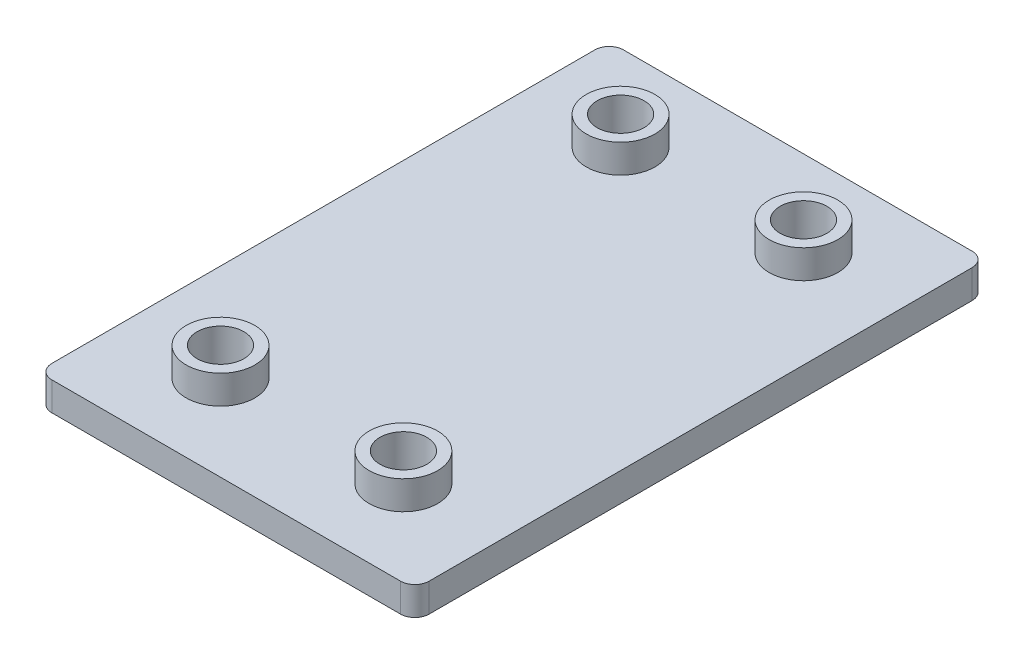
ISO-10303-21;
HEADER;
FILE_DESCRIPTION(('STEP AP214'),'2;1');
FILE_NAME('part.step','',(''),(''),'','','');
FILE_SCHEMA(('AUTOMOTIVE_DESIGN { 1 0 10303 214 1 1 1 1 }'));
ENDSEC;
DATA;
#1=APPLICATION_CONTEXT('core data for automotive mechanical design processes');
#2=APPLICATION_PROTOCOL_DEFINITION('international standard','automotive_design',2000,#1);
#3=PRODUCT_CONTEXT('',#1,'mechanical');
#4=PRODUCT('Part','Part','',(#3));
#5=PRODUCT_RELATED_PRODUCT_CATEGORY('part','',(#4));
#6=PRODUCT_DEFINITION_FORMATION('','',#4);
#7=PRODUCT_DEFINITION_CONTEXT('part definition',#1,'design');
#8=PRODUCT_DEFINITION('design','',#6,#7);
#9=PRODUCT_DEFINITION_SHAPE('','',#8);
#10=(LENGTH_UNIT() NAMED_UNIT(*) SI_UNIT(.MILLI.,.METRE.));
#11=(NAMED_UNIT(*) PLANE_ANGLE_UNIT() SI_UNIT($,.RADIAN.));
#12=(NAMED_UNIT(*) SI_UNIT($,.STERADIAN.) SOLID_ANGLE_UNIT());
#13=UNCERTAINTY_MEASURE_WITH_UNIT(LENGTH_MEASURE(1.E-05),#10,'distance_accuracy_value','');
#14=(GEOMETRIC_REPRESENTATION_CONTEXT(3) GLOBAL_UNCERTAINTY_ASSIGNED_CONTEXT((#13)) GLOBAL_UNIT_ASSIGNED_CONTEXT((#10,
#11,#12)) REPRESENTATION_CONTEXT('',''));
#15=CARTESIAN_POINT('',(0.,0.,0.));
#16=DIRECTION('',(0.,0.,1.));
#17=DIRECTION('',(1.,0.,0.));
#18=AXIS2_PLACEMENT_3D('',#15,#16,#17);
#19=CARTESIAN_POINT('',(-33.,5.,50.));
#20=DIRECTION('',(1.,0.,0.));
#21=DIRECTION('',(0.,0.,-1.));
#22=AXIS2_PLACEMENT_3D('',#19,#20,#21);
#23=PLANE('',#22);
#24=DIRECTION('',(0.,0.,1.));
#25=VECTOR('',#24,1.);
#26=CARTESIAN_POINT('',(-33.,0.,50.));
#27=LINE('',#26,#25);
#28=CARTESIAN_POINT('',(-33.,0.,-47.5));
#29=VERTEX_POINT('',#28);
#30=CARTESIAN_POINT('',(-33.,0.,47.5));
#31=VERTEX_POINT('',#30);
#32=EDGE_CURVE('E128',#29,#31,#27,.T.);
#33=ORIENTED_EDGE('',*,*,#32,.T.);
#34=DIRECTION('',(0.,-1.,0.));
#35=VECTOR('',#34,1.);
#36=CARTESIAN_POINT('',(-33.,5.,47.5));
#37=LINE('',#36,#35);
#38=CARTESIAN_POINT('',(-33.,5.,47.5));
#39=VERTEX_POINT('',#38);
#40=EDGE_CURVE('E151',#31,#39,#37,.F.);
#41=ORIENTED_EDGE('',*,*,#40,.T.);
#42=DIRECTION('',(0.,0.,1.));
#43=VECTOR('',#42,1.);
#44=CARTESIAN_POINT('',(-33.,5.,50.));
#45=LINE('',#44,#43);
#46=CARTESIAN_POINT('',(-33.,5.,-47.5));
#47=VERTEX_POINT('',#46);
#48=EDGE_CURVE('E126',#47,#39,#45,.T.);
#49=ORIENTED_EDGE('',*,*,#48,.F.);
#50=DIRECTION('',(0.,-1.,0.));
#51=VECTOR('',#50,1.);
#52=CARTESIAN_POINT('',(-33.,5.,-47.5));
#53=LINE('',#52,#51);
#54=EDGE_CURVE('E148',#47,#29,#53,.T.);
#55=ORIENTED_EDGE('',*,*,#54,.T.);
#56=EDGE_LOOP('',(#33,#41,#49,#55));
#57=FACE_BOUND('',#56,.T.);
#58=ADVANCED_FACE('F33',(#57),#23,.F.);
#59=CARTESIAN_POINT('',(33.,5.,50.));
#60=DIRECTION('',(0.,0.,-1.));
#61=DIRECTION('',(-1.,0.,0.));
#62=AXIS2_PLACEMENT_3D('',#59,#60,#61);
#63=PLANE('',#62);
#64=DIRECTION('',(1.,0.,0.));
#65=VECTOR('',#64,1.);
#66=CARTESIAN_POINT('',(33.,0.,50.));
#67=LINE('',#66,#65);
#68=CARTESIAN_POINT('',(-30.5,0.,50.));
#69=VERTEX_POINT('',#68);
#70=CARTESIAN_POINT('',(30.5,0.,50.));
#71=VERTEX_POINT('',#70);
#72=EDGE_CURVE('E124',#69,#71,#67,.T.);
#73=ORIENTED_EDGE('',*,*,#72,.T.);
#74=DIRECTION('',(0.,-1.,0.));
#75=VECTOR('',#74,1.);
#76=CARTESIAN_POINT('',(30.5,5.,50.));
#77=LINE('',#76,#75);
#78=CARTESIAN_POINT('',(30.5,5.,50.));
#79=VERTEX_POINT('',#78);
#80=EDGE_CURVE('E103',#71,#79,#77,.F.);
#81=ORIENTED_EDGE('',*,*,#80,.T.);
#82=DIRECTION('',(1.,0.,0.));
#83=VECTOR('',#82,1.);
#84=CARTESIAN_POINT('',(33.,5.,50.));
#85=LINE('',#84,#83);
#86=CARTESIAN_POINT('',(-30.5,5.,50.));
#87=VERTEX_POINT('',#86);
#88=EDGE_CURVE('E167',#87,#79,#85,.T.);
#89=ORIENTED_EDGE('',*,*,#88,.F.);
#90=DIRECTION('',(0.,-1.,0.));
#91=VECTOR('',#90,1.);
#92=CARTESIAN_POINT('',(-30.5,5.,50.));
#93=LINE('',#92,#91);
#94=EDGE_CURVE('E108',#87,#69,#93,.T.);
#95=ORIENTED_EDGE('',*,*,#94,.T.);
#96=EDGE_LOOP('',(#73,#81,#89,#95));
#97=FACE_BOUND('',#96,.T.);
#98=ADVANCED_FACE('F266',(#97),#63,.F.);
#99=CARTESIAN_POINT('',(33.,5.,50.));
#100=DIRECTION('',(-1.,0.,0.));
#101=DIRECTION('',(0.,0.,1.));
#102=AXIS2_PLACEMENT_3D('',#99,#100,#101);
#103=PLANE('',#102);
#104=DIRECTION('',(0.,0.,-1.));
#105=VECTOR('',#104,1.);
#106=CARTESIAN_POINT('',(33.,5.,50.));
#107=LINE('',#106,#105);
#108=CARTESIAN_POINT('',(33.,5.,47.5));
#109=VERTEX_POINT('',#108);
#110=CARTESIAN_POINT('',(33.,5.,-47.5));
#111=VERTEX_POINT('',#110);
#112=EDGE_CURVE('E117',#109,#111,#107,.T.);
#113=ORIENTED_EDGE('',*,*,#112,.F.);
#114=DIRECTION('',(0.,-1.,0.));
#115=VECTOR('',#114,1.);
#116=CARTESIAN_POINT('',(33.,5.,47.5));
#117=LINE('',#116,#115);
#118=CARTESIAN_POINT('',(33.,0.,47.5));
#119=VERTEX_POINT('',#118);
#120=EDGE_CURVE('E102',#109,#119,#117,.T.);
#121=ORIENTED_EDGE('',*,*,#120,.T.);
#122=DIRECTION('',(0.,0.,-1.));
#123=VECTOR('',#122,1.);
#124=CARTESIAN_POINT('',(33.,0.,50.));
#125=LINE('',#124,#123);
#126=CARTESIAN_POINT('',(33.,0.,-47.5));
#127=VERTEX_POINT('',#126);
#128=EDGE_CURVE('E115',#119,#127,#125,.T.);
#129=ORIENTED_EDGE('',*,*,#128,.T.);
#130=DIRECTION('',(0.,-1.,0.));
#131=VECTOR('',#130,1.);
#132=CARTESIAN_POINT('',(33.,5.,-47.5));
#133=LINE('',#132,#131);
#134=EDGE_CURVE('E119',#127,#111,#133,.F.);
#135=ORIENTED_EDGE('',*,*,#134,.T.);
#136=EDGE_LOOP('',(#113,#121,#129,#135));
#137=FACE_BOUND('',#136,.T.);
#138=ADVANCED_FACE('F114',(#137),#103,.F.);
#139=CARTESIAN_POINT('',(33.,5.,-50.));
#140=DIRECTION('',(0.,0.,1.));
#141=DIRECTION('',(1.,0.,0.));
#142=AXIS2_PLACEMENT_3D('',#139,#140,#141);
#143=PLANE('',#142);
#144=DIRECTION('',(-1.,0.,0.));
#145=VECTOR('',#144,1.);
#146=CARTESIAN_POINT('',(33.,0.,-50.));
#147=LINE('',#146,#145);
#148=CARTESIAN_POINT('',(30.5,0.,-50.));
#149=VERTEX_POINT('',#148);
#150=CARTESIAN_POINT('',(-30.5,0.,-50.));
#151=VERTEX_POINT('',#150);
#152=EDGE_CURVE('E123',#149,#151,#147,.T.);
#153=ORIENTED_EDGE('',*,*,#152,.T.);
#154=DIRECTION('',(0.,-1.,0.));
#155=VECTOR('',#154,1.);
#156=CARTESIAN_POINT('',(-30.5,5.,-50.));
#157=LINE('',#156,#155);
#158=CARTESIAN_POINT('',(-30.5,5.,-50.));
#159=VERTEX_POINT('',#158);
#160=EDGE_CURVE('E11',#151,#159,#157,.F.);
#161=ORIENTED_EDGE('',*,*,#160,.T.);
#162=DIRECTION('',(-1.,0.,0.));
#163=VECTOR('',#162,1.);
#164=CARTESIAN_POINT('',(33.,5.,-50.));
#165=LINE('',#164,#163);
#166=CARTESIAN_POINT('',(30.5,5.,-50.));
#167=VERTEX_POINT('',#166);
#168=EDGE_CURVE('E132',#167,#159,#165,.T.);
#169=ORIENTED_EDGE('',*,*,#168,.F.);
#170=DIRECTION('',(0.,-1.,0.));
#171=VECTOR('',#170,1.);
#172=CARTESIAN_POINT('',(30.5,5.,-50.));
#173=LINE('',#172,#171);
#174=EDGE_CURVE('E41',#167,#149,#173,.T.);
#175=ORIENTED_EDGE('',*,*,#174,.T.);
#176=EDGE_LOOP('',(#153,#161,#169,#175));
#177=FACE_BOUND('',#176,.T.);
#178=ADVANCED_FACE('F154',(#177),#143,.F.);
#179=CARTESIAN_POINT('',(0.,5.,0.));
#180=DIRECTION('',(0.,1.,0.));
#181=DIRECTION('',(0.,0.,1.));
#182=AXIS2_PLACEMENT_3D('',#179,#180,#181);
#183=PLANE('',#182);
#184=CARTESIAN_POINT('',(-16.,5.,35.));
#185=DIRECTION('',(0.,1.,0.));
#186=DIRECTION('',(0.,0.,-1.));
#187=AXIS2_PLACEMENT_3D('',#184,#185,#186);
#188=CIRCLE('',#187,6.);
#189=CARTESIAN_POINT('',(-16.,5.,29.));
#190=VERTEX_POINT('',#189);
#191=EDGE_CURVE('E195',#190,#190,#188,.T.);
#192=ORIENTED_EDGE('',*,*,#191,.F.);
#193=EDGE_LOOP('',(#192));
#194=FACE_BOUND('',#193,.T.);
#195=CARTESIAN_POINT('',(16.,5.,35.));
#196=DIRECTION('',(0.,1.,0.));
#197=DIRECTION('',(0.,0.,1.));
#198=AXIS2_PLACEMENT_3D('',#195,#196,#197);
#199=CIRCLE('',#198,6.);
#200=CARTESIAN_POINT('',(16.,5.,41.));
#201=VERTEX_POINT('',#200);
#202=EDGE_CURVE('E189',#201,#201,#199,.T.);
#203=ORIENTED_EDGE('',*,*,#202,.F.);
#204=EDGE_LOOP('',(#203));
#205=FACE_BOUND('',#204,.T.);
#206=CARTESIAN_POINT('',(16.,5.,-35.));
#207=DIRECTION('',(0.,1.,0.));
#208=DIRECTION('',(0.,0.,-1.));
#209=AXIS2_PLACEMENT_3D('',#206,#207,#208);
#210=CIRCLE('',#209,6.);
#211=CARTESIAN_POINT('',(16.,5.,-41.));
#212=VERTEX_POINT('',#211);
#213=EDGE_CURVE('E183',#212,#212,#210,.T.);
#214=ORIENTED_EDGE('',*,*,#213,.F.);
#215=EDGE_LOOP('',(#214));
#216=FACE_BOUND('',#215,.T.);
#217=CARTESIAN_POINT('',(-16.,5.,-35.));
#218=DIRECTION('',(0.,1.,0.));
#219=DIRECTION('',(0.,0.,1.));
#220=AXIS2_PLACEMENT_3D('',#217,#218,#219);
#221=CIRCLE('',#220,6.);
#222=CARTESIAN_POINT('',(-16.,5.,-29.));
#223=VERTEX_POINT('',#222);
#224=EDGE_CURVE('E172',#223,#223,#221,.T.);
#225=ORIENTED_EDGE('',*,*,#224,.F.);
#226=EDGE_LOOP('',(#225));
#227=FACE_BOUND('',#226,.T.);
#228=ORIENTED_EDGE('',*,*,#88,.T.);
#229=CARTESIAN_POINT('',(30.5,5.,47.5));
#230=DIRECTION('',(0.,1.,0.));
#231=DIRECTION('',(0.,0.,1.));
#232=AXIS2_PLACEMENT_3D('',#229,#230,#231);
#233=CIRCLE('',#232,2.5);
#234=EDGE_CURVE('E146',#79,#109,#233,.T.);
#235=ORIENTED_EDGE('',*,*,#234,.T.);
#236=ORIENTED_EDGE('',*,*,#112,.T.);
#237=CARTESIAN_POINT('',(30.5,5.,-47.5));
#238=DIRECTION('',(0.,1.,0.));
#239=DIRECTION('',(0.,0.,1.));
#240=AXIS2_PLACEMENT_3D('',#237,#238,#239);
#241=CIRCLE('',#240,2.5);
#242=EDGE_CURVE('E53',#111,#167,#241,.T.);
#243=ORIENTED_EDGE('',*,*,#242,.T.);
#244=ORIENTED_EDGE('',*,*,#168,.T.);
#245=CARTESIAN_POINT('',(-30.5,5.,-47.5));
#246=DIRECTION('',(0.,1.,0.));
#247=DIRECTION('',(0.,0.,1.));
#248=AXIS2_PLACEMENT_3D('',#245,#246,#247);
#249=CIRCLE('',#248,2.5);
#250=EDGE_CURVE('E142',#159,#47,#249,.T.);
#251=ORIENTED_EDGE('',*,*,#250,.T.);
#252=ORIENTED_EDGE('',*,*,#48,.T.);
#253=CARTESIAN_POINT('',(-30.5,5.,47.5));
#254=DIRECTION('',(0.,1.,0.));
#255=DIRECTION('',(0.,0.,1.));
#256=AXIS2_PLACEMENT_3D('',#253,#254,#255);
#257=CIRCLE('',#256,2.5);
#258=EDGE_CURVE('E144',#39,#87,#257,.T.);
#259=ORIENTED_EDGE('',*,*,#258,.T.);
#260=EDGE_LOOP('',(#228,#235,#236,#243,#244,#251,#252,#259));
#261=FACE_BOUND('',#260,.T.);
#262=ADVANCED_FACE('F286',(#194,#205,#216,#227,#261),#183,.T.);
#263=CARTESIAN_POINT('',(0.,0.,0.));
#264=DIRECTION('',(0.,1.,0.));
#265=DIRECTION('',(0.,0.,1.));
#266=AXIS2_PLACEMENT_3D('',#263,#264,#265);
#267=PLANE('',#266);
#268=CARTESIAN_POINT('',(-16.,0.,-35.));
#269=DIRECTION('',(0.,1.,0.));
#270=DIRECTION('',(0.,0.,1.));
#271=AXIS2_PLACEMENT_3D('',#268,#269,#270);
#272=CIRCLE('',#271,2.5);
#273=CARTESIAN_POINT('',(-16.,0.,-32.5));
#274=VERTEX_POINT('',#273);
#275=EDGE_CURVE('E236',#274,#274,#272,.T.);
#276=ORIENTED_EDGE('',*,*,#275,.T.);
#277=EDGE_LOOP('',(#276));
#278=FACE_BOUND('',#277,.T.);
#279=CARTESIAN_POINT('',(16.,0.,-35.));
#280=DIRECTION('',(0.,1.,0.));
#281=DIRECTION('',(0.,0.,1.));
#282=AXIS2_PLACEMENT_3D('',#279,#280,#281);
#283=CIRCLE('',#282,2.5);
#284=CARTESIAN_POINT('',(16.,0.,-32.5));
#285=VERTEX_POINT('',#284);
#286=EDGE_CURVE('E224',#285,#285,#283,.T.);
#287=ORIENTED_EDGE('',*,*,#286,.T.);
#288=EDGE_LOOP('',(#287));
#289=FACE_BOUND('',#288,.T.);
#290=CARTESIAN_POINT('',(16.,0.,35.));
#291=DIRECTION('',(0.,1.,0.));
#292=DIRECTION('',(0.,0.,1.));
#293=AXIS2_PLACEMENT_3D('',#290,#291,#292);
#294=CIRCLE('',#293,2.5);
#295=CARTESIAN_POINT('',(16.,0.,37.5));
#296=VERTEX_POINT('',#295);
#297=EDGE_CURVE('E212',#296,#296,#294,.T.);
#298=ORIENTED_EDGE('',*,*,#297,.T.);
#299=EDGE_LOOP('',(#298));
#300=FACE_BOUND('',#299,.T.);
#301=CARTESIAN_POINT('',(-16.,0.,35.));
#302=DIRECTION('',(0.,1.,0.));
#303=DIRECTION('',(0.,0.,1.));
#304=AXIS2_PLACEMENT_3D('',#301,#302,#303);
#305=CIRCLE('',#304,2.5);
#306=CARTESIAN_POINT('',(-16.,0.,37.5));
#307=VERTEX_POINT('',#306);
#308=EDGE_CURVE('E198',#307,#307,#305,.T.);
#309=ORIENTED_EDGE('',*,*,#308,.T.);
#310=EDGE_LOOP('',(#309));
#311=FACE_BOUND('',#310,.T.);
#312=ORIENTED_EDGE('',*,*,#128,.F.);
#313=CARTESIAN_POINT('',(30.5,0.,47.5));
#314=DIRECTION('',(0.,1.,0.));
#315=DIRECTION('',(0.,0.,1.));
#316=AXIS2_PLACEMENT_3D('',#313,#314,#315);
#317=CIRCLE('',#316,2.5);
#318=EDGE_CURVE('E98',#119,#71,#317,.F.);
#319=ORIENTED_EDGE('',*,*,#318,.T.);
#320=ORIENTED_EDGE('',*,*,#72,.F.);
#321=CARTESIAN_POINT('',(-30.5,0.,47.5));
#322=DIRECTION('',(0.,1.,0.));
#323=DIRECTION('',(0.,0.,1.));
#324=AXIS2_PLACEMENT_3D('',#321,#322,#323);
#325=CIRCLE('',#324,2.5);
#326=EDGE_CURVE('E109',#69,#31,#325,.F.);
#327=ORIENTED_EDGE('',*,*,#326,.T.);
#328=ORIENTED_EDGE('',*,*,#32,.F.);
#329=CARTESIAN_POINT('',(-30.5,0.,-47.5));
#330=DIRECTION('',(0.,1.,0.));
#331=DIRECTION('',(0.,0.,1.));
#332=AXIS2_PLACEMENT_3D('',#329,#330,#331);
#333=CIRCLE('',#332,2.5);
#334=EDGE_CURVE('E135',#29,#151,#333,.F.);
#335=ORIENTED_EDGE('',*,*,#334,.T.);
#336=ORIENTED_EDGE('',*,*,#152,.F.);
#337=CARTESIAN_POINT('',(30.5,0.,-47.5));
#338=DIRECTION('',(0.,1.,0.));
#339=DIRECTION('',(0.,0.,1.));
#340=AXIS2_PLACEMENT_3D('',#337,#338,#339);
#341=CIRCLE('',#340,2.5);
#342=EDGE_CURVE('E118',#149,#127,#341,.F.);
#343=ORIENTED_EDGE('',*,*,#342,.T.);
#344=EDGE_LOOP('',(#312,#319,#320,#327,#328,#335,#336,#343));
#345=FACE_BOUND('',#344,.T.);
#346=ADVANCED_FACE('F121',(#278,#289,#300,#311,#345),#267,.F.);
#347=CARTESIAN_POINT('',(-16.,10.,-35.));
#348=DIRECTION('',(0.,-1.,0.));
#349=DIRECTION('',(0.,0.,-1.));
#350=AXIS2_PLACEMENT_3D('',#347,#348,#349);
#351=CYLINDRICAL_SURFACE('',#350,6.);
#352=CARTESIAN_POINT('',(-16.,10.,-35.));
#353=DIRECTION('',(0.,1.,0.));
#354=DIRECTION('',(0.,0.,1.));
#355=AXIS2_PLACEMENT_3D('',#352,#353,#354);
#356=CIRCLE('',#355,6.);
#357=CARTESIAN_POINT('',(-16.,10.,-29.));
#358=VERTEX_POINT('',#357);
#359=EDGE_CURVE('E176',#358,#358,#356,.T.);
#360=ORIENTED_EDGE('',*,*,#359,.F.);
#361=EDGE_LOOP('',(#360));
#362=FACE_BOUND('',#361,.T.);
#363=ORIENTED_EDGE('',*,*,#224,.T.);
#364=EDGE_LOOP('',(#363));
#365=FACE_BOUND('',#364,.T.);
#366=ADVANCED_FACE('F254',(#362,#365),#351,.T.);
#367=CARTESIAN_POINT('',(-16.,10.,-35.));
#368=DIRECTION('',(0.,1.,0.));
#369=DIRECTION('',(0.,0.,1.));
#370=AXIS2_PLACEMENT_3D('',#367,#368,#369);
#371=PLANE('',#370);
#372=CARTESIAN_POINT('',(-16.,10.,-35.));
#373=DIRECTION('',(0.,1.,0.));
#374=DIRECTION('',(0.,0.,1.));
#375=AXIS2_PLACEMENT_3D('',#372,#373,#374);
#376=CIRCLE('',#375,4.1);
#377=CARTESIAN_POINT('',(-16.,10.,-30.9));
#378=VERTEX_POINT('',#377);
#379=EDGE_CURVE('E245',#378,#378,#376,.T.);
#380=ORIENTED_EDGE('',*,*,#379,.F.);
#381=EDGE_LOOP('',(#380));
#382=FACE_BOUND('',#381,.T.);
#383=ORIENTED_EDGE('',*,*,#359,.T.);
#384=EDGE_LOOP('',(#383));
#385=FACE_BOUND('',#384,.T.);
#386=ADVANCED_FACE('F251',(#382,#385),#371,.T.);
#387=CARTESIAN_POINT('',(16.,10.,-35.));
#388=DIRECTION('',(0.,-1.,0.));
#389=DIRECTION('',(0.,0.,-1.));
#390=AXIS2_PLACEMENT_3D('',#387,#388,#389);
#391=CYLINDRICAL_SURFACE('',#390,6.);
#392=CARTESIAN_POINT('',(16.,10.,-35.));
#393=DIRECTION('',(0.,1.,0.));
#394=DIRECTION('',(0.,0.,-1.));
#395=AXIS2_PLACEMENT_3D('',#392,#393,#394);
#396=CIRCLE('',#395,6.);
#397=CARTESIAN_POINT('',(16.,10.,-41.));
#398=VERTEX_POINT('',#397);
#399=EDGE_CURVE('E181',#398,#398,#396,.T.);
#400=ORIENTED_EDGE('',*,*,#399,.F.);
#401=EDGE_LOOP('',(#400));
#402=FACE_BOUND('',#401,.T.);
#403=ORIENTED_EDGE('',*,*,#213,.T.);
#404=EDGE_LOOP('',(#403));
#405=FACE_BOUND('',#404,.T.);
#406=ADVANCED_FACE('F253',(#402,#405),#391,.T.);
#407=CARTESIAN_POINT('',(16.,10.,-35.));
#408=DIRECTION('',(0.,-1.,0.));
#409=DIRECTION('',(0.,0.,-1.));
#410=AXIS2_PLACEMENT_3D('',#407,#408,#409);
#411=PLANE('',#410);
#412=CARTESIAN_POINT('',(16.,10.,-35.));
#413=DIRECTION('',(0.,1.,0.));
#414=DIRECTION('',(0.,0.,1.));
#415=AXIS2_PLACEMENT_3D('',#412,#413,#414);
#416=CIRCLE('',#415,4.1);
#417=CARTESIAN_POINT('',(16.,10.,-30.9));
#418=VERTEX_POINT('',#417);
#419=EDGE_CURVE('E233',#418,#418,#416,.T.);
#420=ORIENTED_EDGE('',*,*,#419,.F.);
#421=EDGE_LOOP('',(#420));
#422=FACE_BOUND('',#421,.T.);
#423=ORIENTED_EDGE('',*,*,#399,.T.);
#424=EDGE_LOOP('',(#423));
#425=FACE_BOUND('',#424,.T.);
#426=ADVANCED_FACE('F260',(#422,#425),#411,.F.);
#427=CARTESIAN_POINT('',(16.,10.,35.));
#428=DIRECTION('',(0.,-1.,0.));
#429=DIRECTION('',(0.,0.,-1.));
#430=AXIS2_PLACEMENT_3D('',#427,#428,#429);
#431=CYLINDRICAL_SURFACE('',#430,6.);
#432=CARTESIAN_POINT('',(16.,10.,35.));
#433=DIRECTION('',(0.,1.,0.));
#434=DIRECTION('',(0.,0.,1.));
#435=AXIS2_PLACEMENT_3D('',#432,#433,#434);
#436=CIRCLE('',#435,6.);
#437=CARTESIAN_POINT('',(16.,10.,41.));
#438=VERTEX_POINT('',#437);
#439=EDGE_CURVE('E186',#438,#438,#436,.T.);
#440=ORIENTED_EDGE('',*,*,#439,.F.);
#441=EDGE_LOOP('',(#440));
#442=FACE_BOUND('',#441,.T.);
#443=ORIENTED_EDGE('',*,*,#202,.T.);
#444=EDGE_LOOP('',(#443));
#445=FACE_BOUND('',#444,.T.);
#446=ADVANCED_FACE('F462',(#442,#445),#431,.T.);
#447=CARTESIAN_POINT('',(16.,10.,35.));
#448=DIRECTION('',(0.,1.,0.));
#449=DIRECTION('',(0.,0.,1.));
#450=AXIS2_PLACEMENT_3D('',#447,#448,#449);
#451=PLANE('',#450);
#452=CARTESIAN_POINT('',(16.,10.,35.));
#453=DIRECTION('',(0.,1.,0.));
#454=DIRECTION('',(0.,0.,1.));
#455=AXIS2_PLACEMENT_3D('',#452,#453,#454);
#456=CIRCLE('',#455,4.1);
#457=CARTESIAN_POINT('',(16.,10.,39.1));
#458=VERTEX_POINT('',#457);
#459=EDGE_CURVE('E221',#458,#458,#456,.T.);
#460=ORIENTED_EDGE('',*,*,#459,.F.);
#461=EDGE_LOOP('',(#460));
#462=FACE_BOUND('',#461,.T.);
#463=ORIENTED_EDGE('',*,*,#439,.T.);
#464=EDGE_LOOP('',(#463));
#465=FACE_BOUND('',#464,.T.);
#466=ADVANCED_FACE('F454',(#462,#465),#451,.T.);
#467=CARTESIAN_POINT('',(-16.,10.,35.));
#468=DIRECTION('',(0.,-1.,0.));
#469=DIRECTION('',(0.,0.,-1.));
#470=AXIS2_PLACEMENT_3D('',#467,#468,#469);
#471=CYLINDRICAL_SURFACE('',#470,6.);
#472=CARTESIAN_POINT('',(-16.,10.,35.));
#473=DIRECTION('',(0.,1.,0.));
#474=DIRECTION('',(0.,0.,-1.));
#475=AXIS2_PLACEMENT_3D('',#472,#473,#474);
#476=CIRCLE('',#475,6.);
#477=CARTESIAN_POINT('',(-16.,10.,29.));
#478=VERTEX_POINT('',#477);
#479=EDGE_CURVE('E192',#478,#478,#476,.T.);
#480=ORIENTED_EDGE('',*,*,#479,.F.);
#481=EDGE_LOOP('',(#480));
#482=FACE_BOUND('',#481,.T.);
#483=ORIENTED_EDGE('',*,*,#191,.T.);
#484=EDGE_LOOP('',(#483));
#485=FACE_BOUND('',#484,.T.);
#486=ADVANCED_FACE('F445',(#482,#485),#471,.T.);
#487=CARTESIAN_POINT('',(-16.,10.,35.));
#488=DIRECTION('',(0.,-1.,0.));
#489=DIRECTION('',(0.,0.,-1.));
#490=AXIS2_PLACEMENT_3D('',#487,#488,#489);
#491=PLANE('',#490);
#492=CARTESIAN_POINT('',(-16.,10.,35.));
#493=DIRECTION('',(0.,1.,0.));
#494=DIRECTION('',(0.,0.,1.));
#495=AXIS2_PLACEMENT_3D('',#492,#493,#494);
#496=CIRCLE('',#495,4.1);
#497=CARTESIAN_POINT('',(-16.,10.,39.1));
#498=VERTEX_POINT('',#497);
#499=EDGE_CURVE('E209',#498,#498,#496,.T.);
#500=ORIENTED_EDGE('',*,*,#499,.F.);
#501=EDGE_LOOP('',(#500));
#502=FACE_BOUND('',#501,.T.);
#503=ORIENTED_EDGE('',*,*,#479,.T.);
#504=EDGE_LOOP('',(#503));
#505=FACE_BOUND('',#504,.T.);
#506=ADVANCED_FACE('F437',(#502,#505),#491,.F.);
#507=CARTESIAN_POINT('',(-16.,10.,35.));
#508=DIRECTION('',(0.,1.,0.));
#509=DIRECTION('',(0.,0.,1.));
#510=AXIS2_PLACEMENT_3D('',#507,#508,#509);
#511=CYLINDRICAL_SURFACE('',#510,2.5);
#512=ORIENTED_EDGE('',*,*,#308,.F.);
#513=EDGE_LOOP('',(#512));
#514=FACE_BOUND('',#513,.T.);
#515=CARTESIAN_POINT('',(-16.,2.,35.));
#516=DIRECTION('',(0.,1.,0.));
#517=DIRECTION('',(0.,0.,1.));
#518=AXIS2_PLACEMENT_3D('',#515,#516,#517);
#519=CIRCLE('',#518,2.5);
#520=CARTESIAN_POINT('',(-16.,2.,37.5));
#521=VERTEX_POINT('',#520);
#522=EDGE_CURVE('E203',#521,#521,#519,.T.);
#523=ORIENTED_EDGE('',*,*,#522,.T.);
#524=EDGE_LOOP('',(#523));
#525=FACE_BOUND('',#524,.T.);
#526=ADVANCED_FACE('F429',(#514,#525),#511,.F.);
#527=CARTESIAN_POINT('',(-13.5,2.,35.));
#528=DIRECTION('',(0.,-1.,0.));
#529=DIRECTION('',(0.,0.,-1.));
#530=AXIS2_PLACEMENT_3D('',#527,#528,#529);
#531=PLANE('',#530);
#532=ORIENTED_EDGE('',*,*,#522,.F.);
#533=EDGE_LOOP('',(#532));
#534=FACE_BOUND('',#533,.T.);
#535=CARTESIAN_POINT('',(-16.,2.,35.));
#536=DIRECTION('',(0.,1.,0.));
#537=DIRECTION('',(0.,0.,1.));
#538=AXIS2_PLACEMENT_3D('',#535,#536,#537);
#539=CIRCLE('',#538,4.1);
#540=CARTESIAN_POINT('',(-16.,2.,39.1));
#541=VERTEX_POINT('',#540);
#542=EDGE_CURVE('E206',#541,#541,#539,.T.);
#543=ORIENTED_EDGE('',*,*,#542,.T.);
#544=EDGE_LOOP('',(#543));
#545=FACE_BOUND('',#544,.T.);
#546=ADVANCED_FACE('F421',(#534,#545),#531,.F.);
#547=CARTESIAN_POINT('',(-16.,10.,35.));
#548=DIRECTION('',(0.,1.,0.));
#549=DIRECTION('',(0.,0.,1.));
#550=AXIS2_PLACEMENT_3D('',#547,#548,#549);
#551=CYLINDRICAL_SURFACE('',#550,4.1);
#552=ORIENTED_EDGE('',*,*,#542,.F.);
#553=EDGE_LOOP('',(#552));
#554=FACE_BOUND('',#553,.T.);
#555=ORIENTED_EDGE('',*,*,#499,.T.);
#556=EDGE_LOOP('',(#555));
#557=FACE_BOUND('',#556,.T.);
#558=ADVANCED_FACE('F413',(#554,#557),#551,.F.);
#559=CARTESIAN_POINT('',(16.,10.,35.));
#560=DIRECTION('',(0.,1.,0.));
#561=DIRECTION('',(0.,0.,1.));
#562=AXIS2_PLACEMENT_3D('',#559,#560,#561);
#563=CYLINDRICAL_SURFACE('',#562,2.5);
#564=ORIENTED_EDGE('',*,*,#297,.F.);
#565=EDGE_LOOP('',(#564));
#566=FACE_BOUND('',#565,.T.);
#567=CARTESIAN_POINT('',(16.,2.,35.));
#568=DIRECTION('',(0.,1.,0.));
#569=DIRECTION('',(0.,0.,1.));
#570=AXIS2_PLACEMENT_3D('',#567,#568,#569);
#571=CIRCLE('',#570,2.5);
#572=CARTESIAN_POINT('',(16.,2.,37.5));
#573=VERTEX_POINT('',#572);
#574=EDGE_CURVE('E215',#573,#573,#571,.T.);
#575=ORIENTED_EDGE('',*,*,#574,.T.);
#576=EDGE_LOOP('',(#575));
#577=FACE_BOUND('',#576,.T.);
#578=ADVANCED_FACE('F405',(#566,#577),#563,.F.);
#579=CARTESIAN_POINT('',(18.5,2.,35.));
#580=DIRECTION('',(0.,-1.,0.));
#581=DIRECTION('',(0.,0.,-1.));
#582=AXIS2_PLACEMENT_3D('',#579,#580,#581);
#583=PLANE('',#582);
#584=ORIENTED_EDGE('',*,*,#574,.F.);
#585=EDGE_LOOP('',(#584));
#586=FACE_BOUND('',#585,.T.);
#587=CARTESIAN_POINT('',(16.,2.,35.));
#588=DIRECTION('',(0.,1.,0.));
#589=DIRECTION('',(0.,0.,1.));
#590=AXIS2_PLACEMENT_3D('',#587,#588,#589);
#591=CIRCLE('',#590,4.1);
#592=CARTESIAN_POINT('',(16.,2.,39.1));
#593=VERTEX_POINT('',#592);
#594=EDGE_CURVE('E218',#593,#593,#591,.T.);
#595=ORIENTED_EDGE('',*,*,#594,.T.);
#596=EDGE_LOOP('',(#595));
#597=FACE_BOUND('',#596,.T.);
#598=ADVANCED_FACE('F397',(#586,#597),#583,.F.);
#599=CARTESIAN_POINT('',(16.,10.,35.));
#600=DIRECTION('',(0.,1.,0.));
#601=DIRECTION('',(0.,0.,1.));
#602=AXIS2_PLACEMENT_3D('',#599,#600,#601);
#603=CYLINDRICAL_SURFACE('',#602,4.1);
#604=ORIENTED_EDGE('',*,*,#594,.F.);
#605=EDGE_LOOP('',(#604));
#606=FACE_BOUND('',#605,.T.);
#607=ORIENTED_EDGE('',*,*,#459,.T.);
#608=EDGE_LOOP('',(#607));
#609=FACE_BOUND('',#608,.T.);
#610=ADVANCED_FACE('F389',(#606,#609),#603,.F.);
#611=CARTESIAN_POINT('',(16.,10.,-35.));
#612=DIRECTION('',(0.,1.,0.));
#613=DIRECTION('',(0.,0.,1.));
#614=AXIS2_PLACEMENT_3D('',#611,#612,#613);
#615=CYLINDRICAL_SURFACE('',#614,2.5);
#616=ORIENTED_EDGE('',*,*,#286,.F.);
#617=EDGE_LOOP('',(#616));
#618=FACE_BOUND('',#617,.T.);
#619=CARTESIAN_POINT('',(16.,2.,-35.));
#620=DIRECTION('',(0.,1.,0.));
#621=DIRECTION('',(0.,0.,1.));
#622=AXIS2_PLACEMENT_3D('',#619,#620,#621);
#623=CIRCLE('',#622,2.5);
#624=CARTESIAN_POINT('',(16.,2.,-32.5));
#625=VERTEX_POINT('',#624);
#626=EDGE_CURVE('E227',#625,#625,#623,.T.);
#627=ORIENTED_EDGE('',*,*,#626,.T.);
#628=EDGE_LOOP('',(#627));
#629=FACE_BOUND('',#628,.T.);
#630=ADVANCED_FACE('F381',(#618,#629),#615,.F.);
#631=CARTESIAN_POINT('',(18.5,2.,-35.));
#632=DIRECTION('',(0.,-1.,0.));
#633=DIRECTION('',(0.,0.,-1.));
#634=AXIS2_PLACEMENT_3D('',#631,#632,#633);
#635=PLANE('',#634);
#636=ORIENTED_EDGE('',*,*,#626,.F.);
#637=EDGE_LOOP('',(#636));
#638=FACE_BOUND('',#637,.T.);
#639=CARTESIAN_POINT('',(16.,2.,-35.));
#640=DIRECTION('',(0.,1.,0.));
#641=DIRECTION('',(0.,0.,1.));
#642=AXIS2_PLACEMENT_3D('',#639,#640,#641);
#643=CIRCLE('',#642,4.1);
#644=CARTESIAN_POINT('',(16.,2.,-30.9));
#645=VERTEX_POINT('',#644);
#646=EDGE_CURVE('E230',#645,#645,#643,.T.);
#647=ORIENTED_EDGE('',*,*,#646,.T.);
#648=EDGE_LOOP('',(#647));
#649=FACE_BOUND('',#648,.T.);
#650=ADVANCED_FACE('F373',(#638,#649),#635,.F.);
#651=CARTESIAN_POINT('',(16.,10.,-35.));
#652=DIRECTION('',(0.,1.,0.));
#653=DIRECTION('',(0.,0.,1.));
#654=AXIS2_PLACEMENT_3D('',#651,#652,#653);
#655=CYLINDRICAL_SURFACE('',#654,4.1);
#656=ORIENTED_EDGE('',*,*,#646,.F.);
#657=EDGE_LOOP('',(#656));
#658=FACE_BOUND('',#657,.T.);
#659=ORIENTED_EDGE('',*,*,#419,.T.);
#660=EDGE_LOOP('',(#659));
#661=FACE_BOUND('',#660,.T.);
#662=ADVANCED_FACE('F365',(#658,#661),#655,.F.);
#663=CARTESIAN_POINT('',(-16.,10.,-35.));
#664=DIRECTION('',(0.,1.,0.));
#665=DIRECTION('',(0.,0.,1.));
#666=AXIS2_PLACEMENT_3D('',#663,#664,#665);
#667=CYLINDRICAL_SURFACE('',#666,2.5);
#668=ORIENTED_EDGE('',*,*,#275,.F.);
#669=EDGE_LOOP('',(#668));
#670=FACE_BOUND('',#669,.T.);
#671=CARTESIAN_POINT('',(-16.,2.,-35.));
#672=DIRECTION('',(0.,1.,0.));
#673=DIRECTION('',(0.,0.,1.));
#674=AXIS2_PLACEMENT_3D('',#671,#672,#673);
#675=CIRCLE('',#674,2.5);
#676=CARTESIAN_POINT('',(-16.,2.,-32.5));
#677=VERTEX_POINT('',#676);
#678=EDGE_CURVE('E239',#677,#677,#675,.T.);
#679=ORIENTED_EDGE('',*,*,#678,.T.);
#680=EDGE_LOOP('',(#679));
#681=FACE_BOUND('',#680,.T.);
#682=ADVANCED_FACE('F357',(#670,#681),#667,.F.);
#683=CARTESIAN_POINT('',(-13.5,2.,-35.));
#684=DIRECTION('',(0.,-1.,0.));
#685=DIRECTION('',(0.,0.,-1.));
#686=AXIS2_PLACEMENT_3D('',#683,#684,#685);
#687=PLANE('',#686);
#688=ORIENTED_EDGE('',*,*,#678,.F.);
#689=EDGE_LOOP('',(#688));
#690=FACE_BOUND('',#689,.T.);
#691=CARTESIAN_POINT('',(-16.,2.,-35.));
#692=DIRECTION('',(0.,1.,0.));
#693=DIRECTION('',(0.,0.,1.));
#694=AXIS2_PLACEMENT_3D('',#691,#692,#693);
#695=CIRCLE('',#694,4.1);
#696=CARTESIAN_POINT('',(-16.,2.,-30.9));
#697=VERTEX_POINT('',#696);
#698=EDGE_CURVE('E242',#697,#697,#695,.T.);
#699=ORIENTED_EDGE('',*,*,#698,.T.);
#700=EDGE_LOOP('',(#699));
#701=FACE_BOUND('',#700,.T.);
#702=ADVANCED_FACE('F350',(#690,#701),#687,.F.);
#703=CARTESIAN_POINT('',(-16.,10.,-35.));
#704=DIRECTION('',(0.,1.,0.));
#705=DIRECTION('',(0.,0.,1.));
#706=AXIS2_PLACEMENT_3D('',#703,#704,#705);
#707=CYLINDRICAL_SURFACE('',#706,4.1);
#708=ORIENTED_EDGE('',*,*,#698,.F.);
#709=EDGE_LOOP('',(#708));
#710=FACE_BOUND('',#709,.T.);
#711=ORIENTED_EDGE('',*,*,#379,.T.);
#712=EDGE_LOOP('',(#711));
#713=FACE_BOUND('',#712,.T.);
#714=ADVANCED_FACE('F249',(#710,#713),#707,.F.);
#715=CARTESIAN_POINT('',(30.5,5.,47.5));
#716=DIRECTION('',(0.,-1.,0.));
#717=DIRECTION('',(0.,0.,-1.));
#718=AXIS2_PLACEMENT_3D('',#715,#716,#717);
#719=CYLINDRICAL_SURFACE('',#718,2.5);
#720=ORIENTED_EDGE('',*,*,#234,.F.);
#721=ORIENTED_EDGE('',*,*,#80,.F.);
#722=ORIENTED_EDGE('',*,*,#318,.F.);
#723=ORIENTED_EDGE('',*,*,#120,.F.);
#724=EDGE_LOOP('',(#720,#721,#722,#723));
#725=FACE_BOUND('',#724,.T.);
#726=ADVANCED_FACE('F101',(#725),#719,.T.);
#727=CARTESIAN_POINT('',(-30.5,5.,47.5));
#728=DIRECTION('',(0.,-1.,0.));
#729=DIRECTION('',(0.,0.,-1.));
#730=AXIS2_PLACEMENT_3D('',#727,#728,#729);
#731=CYLINDRICAL_SURFACE('',#730,2.5);
#732=ORIENTED_EDGE('',*,*,#258,.F.);
#733=ORIENTED_EDGE('',*,*,#40,.F.);
#734=ORIENTED_EDGE('',*,*,#326,.F.);
#735=ORIENTED_EDGE('',*,*,#94,.F.);
#736=EDGE_LOOP('',(#732,#733,#734,#735));
#737=FACE_BOUND('',#736,.T.);
#738=ADVANCED_FACE('F277',(#737),#731,.T.);
#739=CARTESIAN_POINT('',(-30.5,5.,-47.5));
#740=DIRECTION('',(0.,-1.,0.));
#741=DIRECTION('',(0.,0.,-1.));
#742=AXIS2_PLACEMENT_3D('',#739,#740,#741);
#743=CYLINDRICAL_SURFACE('',#742,2.5);
#744=ORIENTED_EDGE('',*,*,#250,.F.);
#745=ORIENTED_EDGE('',*,*,#160,.F.);
#746=ORIENTED_EDGE('',*,*,#334,.F.);
#747=ORIENTED_EDGE('',*,*,#54,.F.);
#748=EDGE_LOOP('',(#744,#745,#746,#747));
#749=FACE_BOUND('',#748,.T.);
#750=ADVANCED_FACE('F161',(#749),#743,.T.);
#751=CARTESIAN_POINT('',(30.5,5.,-47.5));
#752=DIRECTION('',(0.,-1.,0.));
#753=DIRECTION('',(0.,0.,-1.));
#754=AXIS2_PLACEMENT_3D('',#751,#752,#753);
#755=CYLINDRICAL_SURFACE('',#754,2.5);
#756=ORIENTED_EDGE('',*,*,#242,.F.);
#757=ORIENTED_EDGE('',*,*,#134,.F.);
#758=ORIENTED_EDGE('',*,*,#342,.F.);
#759=ORIENTED_EDGE('',*,*,#174,.F.);
#760=EDGE_LOOP('',(#756,#757,#758,#759));
#761=FACE_BOUND('',#760,.T.);
#762=ADVANCED_FACE('F35',(#761),#755,.T.);
#763=CLOSED_SHELL('',(#58,#98,#138,#178,#262,#346,#366,#386,#406,#426,#446,#466,#486,#506,#526,
#546,#558,#578,#598,#610,#630,#650,#662,#682,#702,#714,#726,#738,#750,#762));
#764=MANIFOLD_SOLID_BREP('B2',#763);
#765=ADVANCED_BREP_SHAPE_REPRESENTATION('',(#18,#764),#14);
#766=SHAPE_DEFINITION_REPRESENTATION(#9,#765);
ENDSEC;
END-ISO-10303-21;
